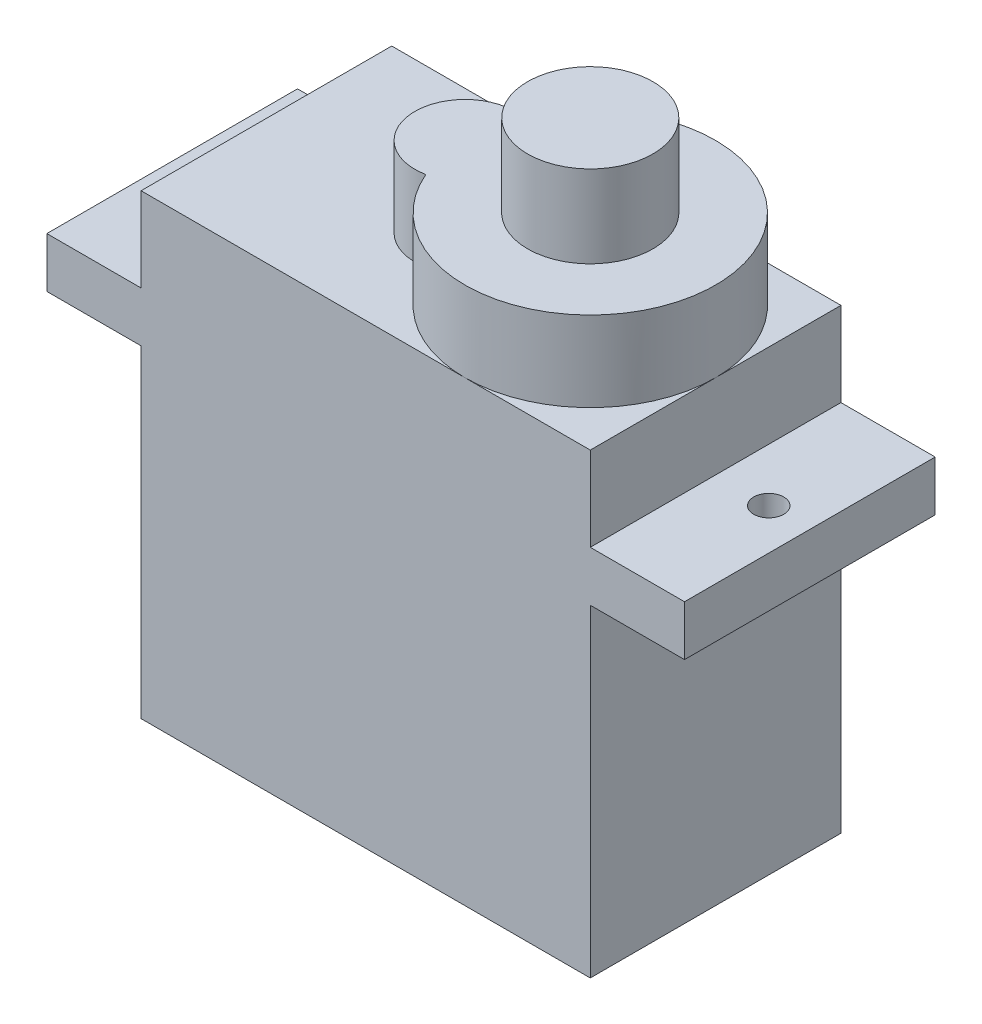
ISO-10303-21;
HEADER;
FILE_DESCRIPTION(('STEP AP214'),'2;1');
FILE_NAME('part.step','',(''),(''),'','','');
FILE_SCHEMA(('AUTOMOTIVE_DESIGN { 1 0 10303 214 1 1 1 1 }'));
ENDSEC;
DATA;
#1=APPLICATION_CONTEXT('core data for automotive mechanical design processes');
#2=APPLICATION_PROTOCOL_DEFINITION('international standard','automotive_design',2000,#1);
#3=PRODUCT_CONTEXT('',#1,'mechanical');
#4=PRODUCT('Part','Part','',(#3));
#5=PRODUCT_RELATED_PRODUCT_CATEGORY('part','',(#4));
#6=PRODUCT_DEFINITION_FORMATION('','',#4);
#7=PRODUCT_DEFINITION_CONTEXT('part definition',#1,'design');
#8=PRODUCT_DEFINITION('design','',#6,#7);
#9=PRODUCT_DEFINITION_SHAPE('','',#8);
#10=(LENGTH_UNIT() NAMED_UNIT(*) SI_UNIT(.MILLI.,.METRE.));
#11=(NAMED_UNIT(*) PLANE_ANGLE_UNIT() SI_UNIT($,.RADIAN.));
#12=(NAMED_UNIT(*) SI_UNIT($,.STERADIAN.) SOLID_ANGLE_UNIT());
#13=UNCERTAINTY_MEASURE_WITH_UNIT(LENGTH_MEASURE(1.E-05),#10,'distance_accuracy_value','');
#14=(GEOMETRIC_REPRESENTATION_CONTEXT(3) GLOBAL_UNCERTAINTY_ASSIGNED_CONTEXT((#13)) GLOBAL_UNIT_ASSIGNED_CONTEXT((#10,
#11,#12)) REPRESENTATION_CONTEXT('',''));
#15=CARTESIAN_POINT('',(0.,0.,0.));
#16=DIRECTION('',(0.,0.,1.));
#17=DIRECTION('',(1.,0.,0.));
#18=AXIS2_PLACEMENT_3D('',#15,#16,#17);
#19=CARTESIAN_POINT('',(0.,22.8,0.));
#20=DIRECTION('',(0.,-1.,0.));
#21=DIRECTION('',(0.,0.,-1.));
#22=AXIS2_PLACEMENT_3D('',#19,#20,#21);
#23=PLANE('',#22);
#24=CARTESIAN_POINT('',(-1.3,22.8,0.));
#25=DIRECTION('',(0.,1.,0.));
#26=DIRECTION('',(0.,0.,1.));
#27=AXIS2_PLACEMENT_3D('',#24,#25,#26);
#28=CIRCLE('',#27,2.5);
#29=CARTESIAN_POINT('',(-0.800000000000001,22.8,-2.44948974278318));
#30=VERTEX_POINT('',#29);
#31=CARTESIAN_POINT('',(-0.800000000000003,22.8,2.44948974278318));
#32=VERTEX_POINT('',#31);
#33=EDGE_CURVE('E163',#30,#32,#28,.T.);
#34=ORIENTED_EDGE('',*,*,#33,.F.);
#35=CARTESIAN_POINT('',(4.95,22.8,0.));
#36=DIRECTION('',(0.,1.,0.));
#37=DIRECTION('',(0.,0.,1.));
#38=AXIS2_PLACEMENT_3D('',#35,#36,#37);
#39=CIRCLE('',#38,6.25);
#40=CARTESIAN_POINT('',(4.95,22.8,-6.25));
#41=VERTEX_POINT('',#40);
#42=EDGE_CURVE('E299',#41,#30,#39,.T.);
#43=ORIENTED_EDGE('',*,*,#42,.F.);
#44=DIRECTION('',(-1.,0.,0.));
#45=VECTOR('',#44,1.);
#46=CARTESIAN_POINT('',(-11.2,22.8,-6.25));
#47=LINE('',#46,#45);
#48=CARTESIAN_POINT('',(-11.2,22.8,-6.25));
#49=VERTEX_POINT('',#48);
#50=EDGE_CURVE('E229',#41,#49,#47,.T.);
#51=ORIENTED_EDGE('',*,*,#50,.T.);
#52=DIRECTION('',(0.,0.,1.));
#53=VECTOR('',#52,1.);
#54=CARTESIAN_POINT('',(-11.2,22.8,6.25));
#55=LINE('',#54,#53);
#56=CARTESIAN_POINT('',(-11.2,22.8,6.25));
#57=VERTEX_POINT('',#56);
#58=EDGE_CURVE('E234',#49,#57,#55,.T.);
#59=ORIENTED_EDGE('',*,*,#58,.T.);
#60=DIRECTION('',(1.,0.,0.));
#61=VECTOR('',#60,1.);
#62=CARTESIAN_POINT('',(-11.2,22.8,6.25));
#63=LINE('',#62,#61);
#64=CARTESIAN_POINT('',(4.95,22.8,6.25));
#65=VERTEX_POINT('',#64);
#66=EDGE_CURVE('E237',#57,#65,#63,.T.);
#67=ORIENTED_EDGE('',*,*,#66,.T.);
#68=EDGE_CURVE('E51',#32,#65,#39,.T.);
#69=ORIENTED_EDGE('',*,*,#68,.F.);
#70=EDGE_LOOP('',(#34,#43,#51,#59,#67,#69));
#71=FACE_BOUND('',#70,.T.);
#72=ADVANCED_FACE('F34',(#71),#23,.F.);
#73=CARTESIAN_POINT('',(11.2,22.8,0.));
#74=VERTEX_POINT('',#73);
#75=EDGE_CURVE('E43',#65,#74,#39,.T.);
#76=ORIENTED_EDGE('',*,*,#75,.F.);
#77=CARTESIAN_POINT('',(11.2,22.8,6.25));
#78=VERTEX_POINT('',#77);
#79=EDGE_CURVE('E236',#65,#78,#63,.T.);
#80=ORIENTED_EDGE('',*,*,#79,.T.);
#81=DIRECTION('',(0.,0.,-1.));
#82=VECTOR('',#81,1.);
#83=CARTESIAN_POINT('',(11.2,22.8,6.25));
#84=LINE('',#83,#82);
#85=EDGE_CURVE('E227',#78,#74,#84,.T.);
#86=ORIENTED_EDGE('',*,*,#85,.T.);
#87=EDGE_LOOP('',(#76,#80,#86));
#88=FACE_BOUND('',#87,.T.);
#89=ADVANCED_FACE('F313',(#88),#23,.F.);
#90=CARTESIAN_POINT('',(11.2,22.8,6.25));
#91=DIRECTION('',(-1.,0.,0.));
#92=DIRECTION('',(0.,0.,1.));
#93=AXIS2_PLACEMENT_3D('',#90,#91,#92);
#94=PLANE('',#93);
#95=DIRECTION('',(0.,0.,1.));
#96=VECTOR('',#95,1.);
#97=CARTESIAN_POINT('',(11.2,18.6,6.25));
#98=LINE('',#97,#96);
#99=CARTESIAN_POINT('',(11.2,18.6,-6.25));
#100=VERTEX_POINT('',#99);
#101=CARTESIAN_POINT('',(11.2,18.6,6.25));
#102=VERTEX_POINT('',#101);
#103=EDGE_CURVE('E224',#100,#102,#98,.T.);
#104=ORIENTED_EDGE('',*,*,#103,.F.);
#105=DIRECTION('',(0.,-1.,0.));
#106=VECTOR('',#105,1.);
#107=CARTESIAN_POINT('',(11.2,22.8,-6.25));
#108=LINE('',#107,#106);
#109=CARTESIAN_POINT('',(11.2,22.8,-6.25));
#110=VERTEX_POINT('',#109);
#111=EDGE_CURVE('E38',#110,#100,#108,.T.);
#112=ORIENTED_EDGE('',*,*,#111,.F.);
#113=EDGE_CURVE('E230',#74,#110,#84,.T.);
#114=ORIENTED_EDGE('',*,*,#113,.F.);
#115=ORIENTED_EDGE('',*,*,#85,.F.);
#116=DIRECTION('',(0.,-1.,0.));
#117=VECTOR('',#116,1.);
#118=CARTESIAN_POINT('',(11.2,22.8,6.25));
#119=LINE('',#118,#117);
#120=EDGE_CURVE('E251',#78,#102,#119,.T.);
#121=ORIENTED_EDGE('',*,*,#120,.T.);
#122=EDGE_LOOP('',(#104,#112,#114,#115,#121));
#123=FACE_BOUND('',#122,.T.);
#124=ADVANCED_FACE('F312',(#123),#94,.F.);
#125=CARTESIAN_POINT('',(-11.2,22.8,6.25));
#126=DIRECTION('',(1.,0.,0.));
#127=DIRECTION('',(0.,0.,-1.));
#128=AXIS2_PLACEMENT_3D('',#125,#126,#127);
#129=PLANE('',#128);
#130=DIRECTION('',(0.,0.,-1.));
#131=VECTOR('',#130,1.);
#132=CARTESIAN_POINT('',(-11.2,18.6,6.25));
#133=LINE('',#132,#131);
#134=CARTESIAN_POINT('',(-11.2,18.6,6.25));
#135=VERTEX_POINT('',#134);
#136=CARTESIAN_POINT('',(-11.2,18.6,-6.25));
#137=VERTEX_POINT('',#136);
#138=EDGE_CURVE('E222',#135,#137,#133,.T.);
#139=ORIENTED_EDGE('',*,*,#138,.F.);
#140=DIRECTION('',(0.,-1.,0.));
#141=VECTOR('',#140,1.);
#142=CARTESIAN_POINT('',(-11.2,22.8,6.25));
#143=LINE('',#142,#141);
#144=EDGE_CURVE('E255',#57,#135,#143,.T.);
#145=ORIENTED_EDGE('',*,*,#144,.F.);
#146=ORIENTED_EDGE('',*,*,#58,.F.);
#147=DIRECTION('',(0.,-1.,0.));
#148=VECTOR('',#147,1.);
#149=CARTESIAN_POINT('',(-11.2,22.8,-6.25));
#150=LINE('',#149,#148);
#151=EDGE_CURVE('E258',#49,#137,#150,.T.);
#152=ORIENTED_EDGE('',*,*,#151,.T.);
#153=EDGE_LOOP('',(#139,#145,#146,#152));
#154=FACE_BOUND('',#153,.T.);
#155=ADVANCED_FACE('F297',(#154),#129,.F.);
#156=CARTESIAN_POINT('',(11.2,16.1,-6.25));
#157=VERTEX_POINT('',#156);
#158=CARTESIAN_POINT('',(11.2,0.,-6.25));
#159=VERTEX_POINT('',#158);
#160=EDGE_CURVE('E260',#157,#159,#108,.T.);
#161=ORIENTED_EDGE('',*,*,#160,.F.);
#162=DIRECTION('',(0.,0.,1.));
#163=VECTOR('',#162,1.);
#164=CARTESIAN_POINT('',(11.2,16.1,6.25));
#165=LINE('',#164,#163);
#166=CARTESIAN_POINT('',(11.2,16.1,6.25));
#167=VERTEX_POINT('',#166);
#168=EDGE_CURVE('E219',#157,#167,#165,.T.);
#169=ORIENTED_EDGE('',*,*,#168,.T.);
#170=CARTESIAN_POINT('',(11.2,0.,6.25));
#171=VERTEX_POINT('',#170);
#172=EDGE_CURVE('E239',#167,#171,#119,.T.);
#173=ORIENTED_EDGE('',*,*,#172,.T.);
#174=DIRECTION('',(0.,0.,-1.));
#175=VECTOR('',#174,1.);
#176=CARTESIAN_POINT('',(11.2,0.,6.25));
#177=LINE('',#176,#175);
#178=EDGE_CURVE('E226',#171,#159,#177,.T.);
#179=ORIENTED_EDGE('',*,*,#178,.T.);
#180=EDGE_LOOP('',(#161,#169,#173,#179));
#181=FACE_BOUND('',#180,.T.);
#182=ADVANCED_FACE('F36',(#181),#94,.F.);
#183=CARTESIAN_POINT('',(-11.2,22.8,-6.25));
#184=DIRECTION('',(0.,0.,1.));
#185=DIRECTION('',(1.,0.,0.));
#186=AXIS2_PLACEMENT_3D('',#183,#184,#185);
#187=PLANE('',#186);
#188=CARTESIAN_POINT('',(-11.2,16.1,-6.25));
#189=VERTEX_POINT('',#188);
#190=CARTESIAN_POINT('',(-11.2,0.,-6.25));
#191=VERTEX_POINT('',#190);
#192=EDGE_CURVE('E257',#189,#191,#150,.T.);
#193=ORIENTED_EDGE('',*,*,#192,.F.);
#194=DIRECTION('',(-1.,0.,0.));
#195=VECTOR('',#194,1.);
#196=CARTESIAN_POINT('',(-15.9,16.1,-6.25));
#197=LINE('',#196,#195);
#198=CARTESIAN_POINT('',(-15.9,16.1,-6.25));
#199=VERTEX_POINT('',#198);
#200=EDGE_CURVE('E196',#189,#199,#197,.T.);
#201=ORIENTED_EDGE('',*,*,#200,.T.);
#202=DIRECTION('',(0.,-1.,0.));
#203=VECTOR('',#202,1.);
#204=CARTESIAN_POINT('',(-15.9,18.6,-6.25));
#205=LINE('',#204,#203);
#206=CARTESIAN_POINT('',(-15.9,18.6,-6.25));
#207=VERTEX_POINT('',#206);
#208=EDGE_CURVE('E210',#207,#199,#205,.T.);
#209=ORIENTED_EDGE('',*,*,#208,.F.);
#210=DIRECTION('',(-1.,0.,0.));
#211=VECTOR('',#210,1.);
#212=CARTESIAN_POINT('',(-15.9,18.6,-6.25));
#213=LINE('',#212,#211);
#214=EDGE_CURVE('E184',#137,#207,#213,.T.);
#215=ORIENTED_EDGE('',*,*,#214,.F.);
#216=ORIENTED_EDGE('',*,*,#151,.F.);
#217=ORIENTED_EDGE('',*,*,#50,.F.);
#218=EDGE_CURVE('E231',#110,#41,#47,.T.);
#219=ORIENTED_EDGE('',*,*,#218,.F.);
#220=ORIENTED_EDGE('',*,*,#111,.T.);
#221=CARTESIAN_POINT('',(15.9,18.6,-6.25));
#222=VERTEX_POINT('',#221);
#223=EDGE_CURVE('E186',#222,#100,#213,.T.);
#224=ORIENTED_EDGE('',*,*,#223,.F.);
#225=DIRECTION('',(0.,-1.,0.));
#226=VECTOR('',#225,1.);
#227=CARTESIAN_POINT('',(15.9,18.6,-6.25));
#228=LINE('',#227,#226);
#229=CARTESIAN_POINT('',(15.9,16.1,-6.25));
#230=VERTEX_POINT('',#229);
#231=EDGE_CURVE('E213',#222,#230,#228,.T.);
#232=ORIENTED_EDGE('',*,*,#231,.T.);
#233=EDGE_CURVE('E197',#230,#157,#197,.T.);
#234=ORIENTED_EDGE('',*,*,#233,.T.);
#235=ORIENTED_EDGE('',*,*,#160,.T.);
#236=DIRECTION('',(-1.,0.,0.));
#237=VECTOR('',#236,1.);
#238=CARTESIAN_POINT('',(-11.2,0.,-6.25));
#239=LINE('',#238,#237);
#240=EDGE_CURVE('E242',#159,#191,#239,.T.);
#241=ORIENTED_EDGE('',*,*,#240,.T.);
#242=EDGE_LOOP('',(#193,#201,#209,#215,#216,#217,#219,#220,#224,#232,#234,#235,#241));
#243=FACE_BOUND('',#242,.T.);
#244=ADVANCED_FACE('F273',(#243),#187,.F.);
#245=CARTESIAN_POINT('',(-11.2,16.1,6.25));
#246=VERTEX_POINT('',#245);
#247=CARTESIAN_POINT('',(-11.2,0.,6.25));
#248=VERTEX_POINT('',#247);
#249=EDGE_CURVE('E254',#246,#248,#143,.T.);
#250=ORIENTED_EDGE('',*,*,#249,.F.);
#251=DIRECTION('',(0.,0.,-1.));
#252=VECTOR('',#251,1.);
#253=CARTESIAN_POINT('',(-11.2,16.1,6.25));
#254=LINE('',#253,#252);
#255=EDGE_CURVE('E216',#246,#189,#254,.T.);
#256=ORIENTED_EDGE('',*,*,#255,.T.);
#257=ORIENTED_EDGE('',*,*,#192,.T.);
#258=DIRECTION('',(0.,0.,1.));
#259=VECTOR('',#258,1.);
#260=CARTESIAN_POINT('',(-11.2,0.,6.25));
#261=LINE('',#260,#259);
#262=EDGE_CURVE('E245',#191,#248,#261,.T.);
#263=ORIENTED_EDGE('',*,*,#262,.T.);
#264=EDGE_LOOP('',(#250,#256,#257,#263));
#265=FACE_BOUND('',#264,.T.);
#266=ADVANCED_FACE('F268',(#265),#129,.F.);
#267=CARTESIAN_POINT('',(-11.2,22.8,6.25));
#268=DIRECTION('',(0.,0.,-1.));
#269=DIRECTION('',(-1.,0.,0.));
#270=AXIS2_PLACEMENT_3D('',#267,#268,#269);
#271=PLANE('',#270);
#272=ORIENTED_EDGE('',*,*,#172,.F.);
#273=DIRECTION('',(1.,0.,0.));
#274=VECTOR('',#273,1.);
#275=CARTESIAN_POINT('',(-15.9,16.1,6.25));
#276=LINE('',#275,#274);
#277=CARTESIAN_POINT('',(15.9,16.1,6.25));
#278=VERTEX_POINT('',#277);
#279=EDGE_CURVE('E202',#167,#278,#276,.T.);
#280=ORIENTED_EDGE('',*,*,#279,.T.);
#281=DIRECTION('',(0.,-1.,0.));
#282=VECTOR('',#281,1.);
#283=CARTESIAN_POINT('',(15.9,18.6,6.25));
#284=LINE('',#283,#282);
#285=CARTESIAN_POINT('',(15.9,18.6,6.25));
#286=VERTEX_POINT('',#285);
#287=EDGE_CURVE('E193',#286,#278,#284,.T.);
#288=ORIENTED_EDGE('',*,*,#287,.F.);
#289=DIRECTION('',(1.,0.,0.));
#290=VECTOR('',#289,1.);
#291=CARTESIAN_POINT('',(-15.9,18.6,6.25));
#292=LINE('',#291,#290);
#293=EDGE_CURVE('E190',#102,#286,#292,.T.);
#294=ORIENTED_EDGE('',*,*,#293,.F.);
#295=ORIENTED_EDGE('',*,*,#120,.F.);
#296=ORIENTED_EDGE('',*,*,#79,.F.);
#297=ORIENTED_EDGE('',*,*,#66,.F.);
#298=ORIENTED_EDGE('',*,*,#144,.T.);
#299=CARTESIAN_POINT('',(-15.9,18.6,6.25));
#300=VERTEX_POINT('',#299);
#301=EDGE_CURVE('E191',#300,#135,#292,.T.);
#302=ORIENTED_EDGE('',*,*,#301,.F.);
#303=DIRECTION('',(0.,-1.,0.));
#304=VECTOR('',#303,1.);
#305=CARTESIAN_POINT('',(-15.9,18.6,6.25));
#306=LINE('',#305,#304);
#307=CARTESIAN_POINT('',(-15.9,16.1,6.25));
#308=VERTEX_POINT('',#307);
#309=EDGE_CURVE('E207',#300,#308,#306,.T.);
#310=ORIENTED_EDGE('',*,*,#309,.T.);
#311=EDGE_CURVE('E185',#308,#246,#276,.T.);
#312=ORIENTED_EDGE('',*,*,#311,.T.);
#313=ORIENTED_EDGE('',*,*,#249,.T.);
#314=DIRECTION('',(1.,0.,0.));
#315=VECTOR('',#314,1.);
#316=CARTESIAN_POINT('',(-11.2,0.,6.25));
#317=LINE('',#316,#315);
#318=EDGE_CURVE('E248',#248,#171,#317,.T.);
#319=ORIENTED_EDGE('',*,*,#318,.T.);
#320=EDGE_LOOP('',(#272,#280,#288,#294,#295,#296,#297,#298,#302,#310,#312,#313,#319));
#321=FACE_BOUND('',#320,.T.);
#322=ADVANCED_FACE('F280',(#321),#271,.F.);
#323=EDGE_CURVE('E301',#74,#41,#39,.T.);
#324=ORIENTED_EDGE('',*,*,#323,.F.);
#325=ORIENTED_EDGE('',*,*,#113,.T.);
#326=ORIENTED_EDGE('',*,*,#218,.T.);
#327=EDGE_LOOP('',(#324,#325,#326));
#328=FACE_BOUND('',#327,.T.);
#329=ADVANCED_FACE('F307',(#328),#23,.F.);
#330=CARTESIAN_POINT('',(0.,0.,0.));
#331=DIRECTION('',(0.,-1.,0.));
#332=DIRECTION('',(0.,0.,-1.));
#333=AXIS2_PLACEMENT_3D('',#330,#331,#332);
#334=PLANE('',#333);
#335=ORIENTED_EDGE('',*,*,#178,.F.);
#336=ORIENTED_EDGE('',*,*,#318,.F.);
#337=ORIENTED_EDGE('',*,*,#262,.F.);
#338=ORIENTED_EDGE('',*,*,#240,.F.);
#339=EDGE_LOOP('',(#335,#336,#337,#338));
#340=FACE_BOUND('',#339,.T.);
#341=ADVANCED_FACE('F277',(#340),#334,.T.);
#342=CARTESIAN_POINT('',(-15.9,18.6,6.25));
#343=DIRECTION('',(1.,0.,0.));
#344=DIRECTION('',(0.,0.,-1.));
#345=AXIS2_PLACEMENT_3D('',#342,#343,#344);
#346=PLANE('',#345);
#347=DIRECTION('',(0.,0.,1.));
#348=VECTOR('',#347,1.);
#349=CARTESIAN_POINT('',(-15.9,16.1,6.25));
#350=LINE('',#349,#348);
#351=EDGE_CURVE('E200',#199,#308,#350,.T.);
#352=ORIENTED_EDGE('',*,*,#351,.T.);
#353=ORIENTED_EDGE('',*,*,#309,.F.);
#354=DIRECTION('',(0.,0.,1.));
#355=VECTOR('',#354,1.);
#356=CARTESIAN_POINT('',(-15.9,18.6,6.25));
#357=LINE('',#356,#355);
#358=EDGE_CURVE('E188',#207,#300,#357,.T.);
#359=ORIENTED_EDGE('',*,*,#358,.F.);
#360=ORIENTED_EDGE('',*,*,#208,.T.);
#361=EDGE_LOOP('',(#352,#353,#359,#360));
#362=FACE_BOUND('',#361,.T.);
#363=ADVANCED_FACE('F291',(#362),#346,.F.);
#364=CARTESIAN_POINT('',(0.,18.6,0.));
#365=DIRECTION('',(0.,-1.,0.));
#366=DIRECTION('',(0.,0.,-1.));
#367=AXIS2_PLACEMENT_3D('',#364,#365,#366);
#368=PLANE('',#367);
#369=CARTESIAN_POINT('',(-13.85,18.6,0.));
#370=DIRECTION('',(0.,1.,0.));
#371=DIRECTION('',(0.,0.,1.));
#372=AXIS2_PLACEMENT_3D('',#369,#370,#371);
#373=CIRCLE('',#372,0.75);
#374=CARTESIAN_POINT('',(-13.85,18.6,0.75));
#375=VERTEX_POINT('',#374);
#376=EDGE_CURVE('E172',#375,#375,#373,.T.);
#377=ORIENTED_EDGE('',*,*,#376,.F.);
#378=EDGE_LOOP('',(#377));
#379=FACE_BOUND('',#378,.T.);
#380=ORIENTED_EDGE('',*,*,#301,.T.);
#381=ORIENTED_EDGE('',*,*,#138,.T.);
#382=ORIENTED_EDGE('',*,*,#214,.T.);
#383=ORIENTED_EDGE('',*,*,#358,.T.);
#384=EDGE_LOOP('',(#380,#381,#382,#383));
#385=FACE_BOUND('',#384,.T.);
#386=ADVANCED_FACE('F293',(#379,#385),#368,.F.);
#387=CARTESIAN_POINT('',(0.,16.1,0.));
#388=DIRECTION('',(0.,-1.,0.));
#389=DIRECTION('',(0.,0.,-1.));
#390=AXIS2_PLACEMENT_3D('',#387,#388,#389);
#391=PLANE('',#390);
#392=CARTESIAN_POINT('',(-13.85,16.1,0.));
#393=DIRECTION('',(0.,-1.,0.));
#394=DIRECTION('',(0.,0.,-1.));
#395=AXIS2_PLACEMENT_3D('',#392,#393,#394);
#396=CIRCLE('',#395,0.75);
#397=CARTESIAN_POINT('',(-13.85,16.1,-0.75));
#398=VERTEX_POINT('',#397);
#399=EDGE_CURVE('E176',#398,#398,#396,.F.);
#400=ORIENTED_EDGE('',*,*,#399,.T.);
#401=EDGE_LOOP('',(#400));
#402=FACE_BOUND('',#401,.T.);
#403=ORIENTED_EDGE('',*,*,#255,.F.);
#404=ORIENTED_EDGE('',*,*,#311,.F.);
#405=ORIENTED_EDGE('',*,*,#351,.F.);
#406=ORIENTED_EDGE('',*,*,#200,.F.);
#407=EDGE_LOOP('',(#403,#404,#405,#406));
#408=FACE_BOUND('',#407,.T.);
#409=ADVANCED_FACE('F286',(#402,#408),#391,.T.);
#410=CARTESIAN_POINT('',(13.85,18.6,0.));
#411=DIRECTION('',(0.,1.,0.));
#412=DIRECTION('',(0.,0.,1.));
#413=AXIS2_PLACEMENT_3D('',#410,#411,#412);
#414=CIRCLE('',#413,0.75);
#415=CARTESIAN_POINT('',(13.85,18.6,0.75));
#416=VERTEX_POINT('',#415);
#417=EDGE_CURVE('E167',#416,#416,#414,.T.);
#418=ORIENTED_EDGE('',*,*,#417,.F.);
#419=EDGE_LOOP('',(#418));
#420=FACE_BOUND('',#419,.T.);
#421=ORIENTED_EDGE('',*,*,#223,.T.);
#422=ORIENTED_EDGE('',*,*,#103,.T.);
#423=ORIENTED_EDGE('',*,*,#293,.T.);
#424=DIRECTION('',(0.,0.,-1.));
#425=VECTOR('',#424,1.);
#426=CARTESIAN_POINT('',(15.9,18.6,6.25));
#427=LINE('',#426,#425);
#428=EDGE_CURVE('E181',#286,#222,#427,.T.);
#429=ORIENTED_EDGE('',*,*,#428,.T.);
#430=EDGE_LOOP('',(#421,#422,#423,#429));
#431=FACE_BOUND('',#430,.T.);
#432=ADVANCED_FACE('F320',(#420,#431),#368,.F.);
#433=CARTESIAN_POINT('',(13.85,16.1,0.));
#434=DIRECTION('',(0.,-1.,0.));
#435=DIRECTION('',(0.,0.,-1.));
#436=AXIS2_PLACEMENT_3D('',#433,#434,#435);
#437=CIRCLE('',#436,0.75);
#438=CARTESIAN_POINT('',(13.85,16.1,-0.75));
#439=VERTEX_POINT('',#438);
#440=EDGE_CURVE('E164',#439,#439,#437,.F.);
#441=ORIENTED_EDGE('',*,*,#440,.T.);
#442=EDGE_LOOP('',(#441));
#443=FACE_BOUND('',#442,.T.);
#444=ORIENTED_EDGE('',*,*,#168,.F.);
#445=ORIENTED_EDGE('',*,*,#233,.F.);
#446=DIRECTION('',(0.,0.,-1.));
#447=VECTOR('',#446,1.);
#448=CARTESIAN_POINT('',(15.9,16.1,6.25));
#449=LINE('',#448,#447);
#450=EDGE_CURVE('E175',#278,#230,#449,.T.);
#451=ORIENTED_EDGE('',*,*,#450,.F.);
#452=ORIENTED_EDGE('',*,*,#279,.F.);
#453=EDGE_LOOP('',(#444,#445,#451,#452));
#454=FACE_BOUND('',#453,.T.);
#455=ADVANCED_FACE('F325',(#443,#454),#391,.T.);
#456=CARTESIAN_POINT('',(15.9,18.6,6.25));
#457=DIRECTION('',(-1.,0.,0.));
#458=DIRECTION('',(0.,0.,1.));
#459=AXIS2_PLACEMENT_3D('',#456,#457,#458);
#460=PLANE('',#459);
#461=ORIENTED_EDGE('',*,*,#450,.T.);
#462=ORIENTED_EDGE('',*,*,#231,.F.);
#463=ORIENTED_EDGE('',*,*,#428,.F.);
#464=ORIENTED_EDGE('',*,*,#287,.T.);
#465=EDGE_LOOP('',(#461,#462,#463,#464));
#466=FACE_BOUND('',#465,.T.);
#467=ADVANCED_FACE('F322',(#466),#460,.F.);
#468=CARTESIAN_POINT('',(13.85,-0.001000000000001,0.));
#469=DIRECTION('',(0.,1.,0.));
#470=DIRECTION('',(0.,0.,1.));
#471=AXIS2_PLACEMENT_3D('',#468,#469,#470);
#472=CYLINDRICAL_SURFACE('',#471,0.75);
#473=ORIENTED_EDGE('',*,*,#440,.F.);
#474=EDGE_LOOP('',(#473));
#475=FACE_BOUND('',#474,.T.);
#476=ORIENTED_EDGE('',*,*,#417,.T.);
#477=EDGE_LOOP('',(#476));
#478=FACE_BOUND('',#477,.T.);
#479=ADVANCED_FACE('F428',(#475,#478),#472,.F.);
#480=CARTESIAN_POINT('',(-13.85,-0.001000000000001,0.));
#481=DIRECTION('',(0.,1.,0.));
#482=DIRECTION('',(0.,0.,1.));
#483=AXIS2_PLACEMENT_3D('',#480,#481,#482);
#484=CYLINDRICAL_SURFACE('',#483,0.75);
#485=ORIENTED_EDGE('',*,*,#399,.F.);
#486=EDGE_LOOP('',(#485));
#487=FACE_BOUND('',#486,.T.);
#488=ORIENTED_EDGE('',*,*,#376,.T.);
#489=EDGE_LOOP('',(#488));
#490=FACE_BOUND('',#489,.T.);
#491=ADVANCED_FACE('F382',(#487,#490),#484,.F.);
#492=CARTESIAN_POINT('',(-1.3,26.8,0.));
#493=DIRECTION('',(0.,-1.,0.));
#494=DIRECTION('',(0.,0.,-1.));
#495=AXIS2_PLACEMENT_3D('',#492,#493,#494);
#496=CYLINDRICAL_SURFACE('',#495,2.5);
#497=ORIENTED_EDGE('',*,*,#33,.T.);
#498=DIRECTION('',(0.,-1.,0.));
#499=VECTOR('',#498,1.);
#500=CARTESIAN_POINT('',(-0.800000000000003,26.8,2.44948974278318));
#501=LINE('',#500,#499);
#502=CARTESIAN_POINT('',(-0.800000000000003,26.8,2.44948974278318));
#503=VERTEX_POINT('',#502);
#504=EDGE_CURVE('E150',#503,#32,#501,.T.);
#505=ORIENTED_EDGE('',*,*,#504,.F.);
#506=CARTESIAN_POINT('',(-1.3,26.8,0.));
#507=DIRECTION('',(0.,1.,0.));
#508=DIRECTION('',(0.,0.,1.));
#509=AXIS2_PLACEMENT_3D('',#506,#507,#508);
#510=CIRCLE('',#509,2.5);
#511=CARTESIAN_POINT('',(-0.800000000000001,26.8,-2.44948974278318));
#512=VERTEX_POINT('',#511);
#513=EDGE_CURVE('E157',#512,#503,#510,.T.);
#514=ORIENTED_EDGE('',*,*,#513,.F.);
#515=DIRECTION('',(0.,-1.,0.));
#516=VECTOR('',#515,1.);
#517=CARTESIAN_POINT('',(-0.800000000000001,26.8,-2.44948974278318));
#518=LINE('',#517,#516);
#519=EDGE_CURVE('E154',#512,#30,#518,.T.);
#520=ORIENTED_EDGE('',*,*,#519,.T.);
#521=EDGE_LOOP('',(#497,#505,#514,#520));
#522=FACE_BOUND('',#521,.T.);
#523=ADVANCED_FACE('F162',(#522),#496,.T.);
#524=CARTESIAN_POINT('',(4.95,26.8,0.));
#525=DIRECTION('',(0.,-1.,0.));
#526=DIRECTION('',(0.,0.,-1.));
#527=AXIS2_PLACEMENT_3D('',#524,#525,#526);
#528=CYLINDRICAL_SURFACE('',#527,6.25);
#529=ORIENTED_EDGE('',*,*,#68,.T.);
#530=ORIENTED_EDGE('',*,*,#75,.T.);
#531=ORIENTED_EDGE('',*,*,#323,.T.);
#532=ORIENTED_EDGE('',*,*,#42,.T.);
#533=ORIENTED_EDGE('',*,*,#519,.F.);
#534=CARTESIAN_POINT('',(4.95,26.8,0.));
#535=DIRECTION('',(0.,1.,0.));
#536=DIRECTION('',(0.,0.,1.));
#537=AXIS2_PLACEMENT_3D('',#534,#535,#536);
#538=CIRCLE('',#537,6.25);
#539=EDGE_CURVE('E146',#503,#512,#538,.T.);
#540=ORIENTED_EDGE('',*,*,#539,.F.);
#541=ORIENTED_EDGE('',*,*,#504,.T.);
#542=EDGE_LOOP('',(#529,#530,#531,#532,#533,#540,#541));
#543=FACE_BOUND('',#542,.T.);
#544=ADVANCED_FACE('F148',(#543),#528,.T.);
#545=CARTESIAN_POINT('',(1.825,26.8,0.));
#546=DIRECTION('',(0.,1.,0.));
#547=DIRECTION('',(0.,0.,1.));
#548=AXIS2_PLACEMENT_3D('',#545,#546,#547);
#549=PLANE('',#548);
#550=CARTESIAN_POINT('',(4.95,26.8,0.));
#551=DIRECTION('',(0.,1.,0.));
#552=DIRECTION('',(0.,0.,1.));
#553=AXIS2_PLACEMENT_3D('',#550,#551,#552);
#554=CIRCLE('',#553,3.125);
#555=CARTESIAN_POINT('',(4.95,26.8,3.125));
#556=VERTEX_POINT('',#555);
#557=EDGE_CURVE('E11',#556,#556,#554,.T.);
#558=ORIENTED_EDGE('',*,*,#557,.F.);
#559=EDGE_LOOP('',(#558));
#560=FACE_BOUND('',#559,.T.);
#561=ORIENTED_EDGE('',*,*,#513,.T.);
#562=ORIENTED_EDGE('',*,*,#539,.T.);
#563=EDGE_LOOP('',(#561,#562));
#564=FACE_BOUND('',#563,.T.);
#565=ADVANCED_FACE('F159',(#560,#564),#549,.T.);
#566=CARTESIAN_POINT('',(4.95,30.9,0.));
#567=DIRECTION('',(0.,-1.,0.));
#568=DIRECTION('',(0.,0.,-1.));
#569=AXIS2_PLACEMENT_3D('',#566,#567,#568);
#570=CYLINDRICAL_SURFACE('',#569,3.125);
#571=CARTESIAN_POINT('',(4.95,30.9,0.));
#572=DIRECTION('',(0.,1.,0.));
#573=DIRECTION('',(0.,0.,1.));
#574=AXIS2_PLACEMENT_3D('',#571,#572,#573);
#575=CIRCLE('',#574,3.125);
#576=CARTESIAN_POINT('',(4.95,30.9,3.125));
#577=VERTEX_POINT('',#576);
#578=EDGE_CURVE('E304',#577,#577,#575,.T.);
#579=ORIENTED_EDGE('',*,*,#578,.F.);
#580=EDGE_LOOP('',(#579));
#581=FACE_BOUND('',#580,.T.);
#582=ORIENTED_EDGE('',*,*,#557,.T.);
#583=EDGE_LOOP('',(#582));
#584=FACE_BOUND('',#583,.T.);
#585=ADVANCED_FACE('F401',(#581,#584),#570,.T.);
#586=CARTESIAN_POINT('',(4.95,30.9,0.));
#587=DIRECTION('',(0.,1.,0.));
#588=DIRECTION('',(0.,0.,1.));
#589=AXIS2_PLACEMENT_3D('',#586,#587,#588);
#590=PLANE('',#589);
#591=ORIENTED_EDGE('',*,*,#578,.T.);
#592=EDGE_LOOP('',(#591));
#593=FACE_BOUND('',#592,.T.);
#594=ADVANCED_FACE('F411',(#593),#590,.T.);
#595=CLOSED_SHELL('',(#72,#89,#124,#155,#182,#244,#266,#322,#329,#341,#363,#386,#409,#432,#455,
#467,#479,#491,#523,#544,#565,#585,#594));
#596=MANIFOLD_SOLID_BREP('B2',#595);
#597=ADVANCED_BREP_SHAPE_REPRESENTATION('',(#18,#596),#14);
#598=SHAPE_DEFINITION_REPRESENTATION(#9,#597);
ENDSEC;
END-ISO-10303-21;
